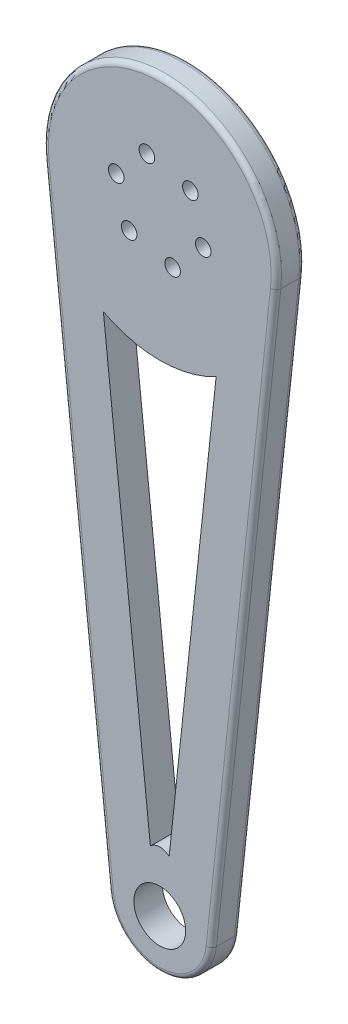
ISO-10303-21;
HEADER;
FILE_DESCRIPTION(('STEP AP214'),'2;1');
FILE_NAME('part.step','',(''),(''),'','','');
FILE_SCHEMA(('AUTOMOTIVE_DESIGN { 1 0 10303 214 1 1 1 1 }'));
ENDSEC;
DATA;
#1=APPLICATION_CONTEXT('core data for automotive mechanical design processes');
#2=APPLICATION_PROTOCOL_DEFINITION('international standard','automotive_design',2000,#1);
#3=PRODUCT_CONTEXT('',#1,'mechanical');
#4=PRODUCT('Part','Part','',(#3));
#5=PRODUCT_RELATED_PRODUCT_CATEGORY('part','',(#4));
#6=PRODUCT_DEFINITION_FORMATION('','',#4);
#7=PRODUCT_DEFINITION_CONTEXT('part definition',#1,'design');
#8=PRODUCT_DEFINITION('design','',#6,#7);
#9=PRODUCT_DEFINITION_SHAPE('','',#8);
#10=(LENGTH_UNIT() NAMED_UNIT(*) SI_UNIT(.MILLI.,.METRE.));
#11=(NAMED_UNIT(*) PLANE_ANGLE_UNIT() SI_UNIT($,.RADIAN.));
#12=(NAMED_UNIT(*) SI_UNIT($,.STERADIAN.) SOLID_ANGLE_UNIT());
#13=UNCERTAINTY_MEASURE_WITH_UNIT(LENGTH_MEASURE(1.E-05),#10,'distance_accuracy_value','');
#14=(GEOMETRIC_REPRESENTATION_CONTEXT(3) GLOBAL_UNCERTAINTY_ASSIGNED_CONTEXT((#13)) GLOBAL_UNIT_ASSIGNED_CONTEXT((#10,
#11,#12)) REPRESENTATION_CONTEXT('',''));
#15=CARTESIAN_POINT('',(0.,0.,0.));
#16=DIRECTION('',(0.,0.,1.));
#17=DIRECTION('',(1.,0.,0.));
#18=AXIS2_PLACEMENT_3D('',#15,#16,#17);
#19=CARTESIAN_POINT('',(-11.8243204000066,-12.5597749612797,-22.));
#20=DIRECTION('',(0.,0.,1.));
#21=DIRECTION('',(1.,0.,0.));
#22=AXIS2_PLACEMENT_3D('',#19,#20,#21);
#23=CYLINDRICAL_SURFACE('',#22,2.);
#24=CARTESIAN_POINT('',(-11.8243204000066,-12.5597749612797,0.));
#25=DIRECTION('',(0.,0.,-1.));
#26=DIRECTION('',(-1.,0.,0.));
#27=AXIS2_PLACEMENT_3D('',#24,#25,#26);
#28=CIRCLE('',#27,2.);
#29=CARTESIAN_POINT('',(-13.8243204000066,-12.5597749612797,0.));
#30=VERTEX_POINT('',#29);
#31=EDGE_CURVE('E239',#30,#30,#28,.T.);
#32=ORIENTED_EDGE('',*,*,#31,.T.);
#33=EDGE_LOOP('',(#32));
#34=FACE_BOUND('',#33,.T.);
#35=CARTESIAN_POINT('',(-11.8243204000066,-12.5597749612797,6.));
#36=DIRECTION('',(0.,0.,1.));
#37=DIRECTION('',(1.,0.,0.));
#38=AXIS2_PLACEMENT_3D('',#35,#36,#37);
#39=CIRCLE('',#38,2.);
#40=CARTESIAN_POINT('',(-9.82432040000657,-12.5597749612797,6.));
#41=VERTEX_POINT('',#40);
#42=EDGE_CURVE('E45',#41,#41,#39,.F.);
#43=ORIENTED_EDGE('',*,*,#42,.F.);
#44=EDGE_LOOP('',(#43));
#45=FACE_BOUND('',#44,.T.);
#46=ADVANCED_FACE('F41',(#34,#45),#23,.F.);
#47=CARTESIAN_POINT('',(4.96492398228066,-16.5200493295321,-22.));
#48=DIRECTION('',(0.,0.,1.));
#49=DIRECTION('',(1.,0.,0.));
#50=AXIS2_PLACEMENT_3D('',#47,#48,#49);
#51=CYLINDRICAL_SURFACE('',#50,2.);
#52=CARTESIAN_POINT('',(4.96492398228066,-16.5200493295321,0.));
#53=DIRECTION('',(0.,0.,-1.));
#54=DIRECTION('',(-1.,0.,0.));
#55=AXIS2_PLACEMENT_3D('',#52,#53,#54);
#56=CIRCLE('',#55,2.);
#57=CARTESIAN_POINT('',(2.96492398228065,-16.5200493295321,0.));
#58=VERTEX_POINT('',#57);
#59=EDGE_CURVE('E242',#58,#58,#56,.T.);
#60=ORIENTED_EDGE('',*,*,#59,.T.);
#61=EDGE_LOOP('',(#60));
#62=FACE_BOUND('',#61,.T.);
#63=CARTESIAN_POINT('',(4.96492398228066,-16.5200493295321,6.));
#64=DIRECTION('',(0.,0.,1.));
#65=DIRECTION('',(1.,0.,0.));
#66=AXIS2_PLACEMENT_3D('',#63,#64,#65);
#67=CIRCLE('',#66,2.);
#68=CARTESIAN_POINT('',(6.96492398228066,-16.5200493295321,6.));
#69=VERTEX_POINT('',#68);
#70=EDGE_CURVE('E269',#69,#69,#67,.F.);
#71=ORIENTED_EDGE('',*,*,#70,.F.);
#72=EDGE_LOOP('',(#71));
#73=FACE_BOUND('',#72,.T.);
#74=ADVANCED_FACE('F279',(#62,#73),#51,.F.);
#75=CARTESIAN_POINT('',(16.7892443822872,-3.96027436825241,-22.));
#76=DIRECTION('',(0.,0.,1.));
#77=DIRECTION('',(1.,0.,0.));
#78=AXIS2_PLACEMENT_3D('',#75,#76,#77);
#79=CYLINDRICAL_SURFACE('',#78,2.);
#80=CARTESIAN_POINT('',(16.7892443822872,-3.96027436825241,0.));
#81=DIRECTION('',(0.,0.,-1.));
#82=DIRECTION('',(-1.,0.,0.));
#83=AXIS2_PLACEMENT_3D('',#80,#81,#82);
#84=CIRCLE('',#83,2.);
#85=CARTESIAN_POINT('',(14.7892443822872,-3.96027436825241,0.));
#86=VERTEX_POINT('',#85);
#87=EDGE_CURVE('E245',#86,#86,#84,.T.);
#88=ORIENTED_EDGE('',*,*,#87,.T.);
#89=EDGE_LOOP('',(#88));
#90=FACE_BOUND('',#89,.T.);
#91=CARTESIAN_POINT('',(16.7892443822872,-3.96027436825241,6.));
#92=DIRECTION('',(0.,0.,1.));
#93=DIRECTION('',(1.,0.,0.));
#94=AXIS2_PLACEMENT_3D('',#91,#92,#93);
#95=CIRCLE('',#94,2.);
#96=CARTESIAN_POINT('',(18.7892443822872,-3.96027436825241,6.));
#97=VERTEX_POINT('',#96);
#98=EDGE_CURVE('E267',#97,#97,#95,.F.);
#99=ORIENTED_EDGE('',*,*,#98,.F.);
#100=EDGE_LOOP('',(#99));
#101=FACE_BOUND('',#100,.T.);
#102=ADVANCED_FACE('F286',(#90,#101),#79,.F.);
#103=CARTESIAN_POINT('',(11.8243204000066,12.5597749612797,-22.));
#104=DIRECTION('',(0.,0.,1.));
#105=DIRECTION('',(1.,0.,0.));
#106=AXIS2_PLACEMENT_3D('',#103,#104,#105);
#107=CYLINDRICAL_SURFACE('',#106,2.);
#108=CARTESIAN_POINT('',(11.8243204000066,12.5597749612797,0.));
#109=DIRECTION('',(0.,0.,-1.));
#110=DIRECTION('',(-1.,0.,0.));
#111=AXIS2_PLACEMENT_3D('',#108,#109,#110);
#112=CIRCLE('',#111,2.);
#113=CARTESIAN_POINT('',(9.82432040000657,12.5597749612797,0.));
#114=VERTEX_POINT('',#113);
#115=EDGE_CURVE('E248',#114,#114,#112,.T.);
#116=ORIENTED_EDGE('',*,*,#115,.T.);
#117=EDGE_LOOP('',(#116));
#118=FACE_BOUND('',#117,.T.);
#119=CARTESIAN_POINT('',(11.8243204000066,12.5597749612797,6.));
#120=DIRECTION('',(0.,0.,1.));
#121=DIRECTION('',(1.,0.,0.));
#122=AXIS2_PLACEMENT_3D('',#119,#120,#121);
#123=CIRCLE('',#122,2.);
#124=CARTESIAN_POINT('',(13.8243204000066,12.5597749612797,6.));
#125=VERTEX_POINT('',#124);
#126=EDGE_CURVE('E264',#125,#125,#123,.F.);
#127=ORIENTED_EDGE('',*,*,#126,.F.);
#128=EDGE_LOOP('',(#127));
#129=FACE_BOUND('',#128,.T.);
#130=ADVANCED_FACE('F594',(#118,#129),#107,.F.);
#131=CARTESIAN_POINT('',(-4.96492398228065,16.5200493295321,-22.));
#132=DIRECTION('',(0.,0.,1.));
#133=DIRECTION('',(1.,0.,0.));
#134=AXIS2_PLACEMENT_3D('',#131,#132,#133);
#135=CYLINDRICAL_SURFACE('',#134,2.);
#136=CARTESIAN_POINT('',(-4.96492398228065,16.5200493295321,0.));
#137=DIRECTION('',(0.,0.,-1.));
#138=DIRECTION('',(-1.,0.,0.));
#139=AXIS2_PLACEMENT_3D('',#136,#137,#138);
#140=CIRCLE('',#139,2.);
#141=CARTESIAN_POINT('',(-6.96492398228065,16.5200493295321,0.));
#142=VERTEX_POINT('',#141);
#143=EDGE_CURVE('E251',#142,#142,#140,.T.);
#144=ORIENTED_EDGE('',*,*,#143,.T.);
#145=EDGE_LOOP('',(#144));
#146=FACE_BOUND('',#145,.T.);
#147=CARTESIAN_POINT('',(-4.96492398228065,16.5200493295321,6.));
#148=DIRECTION('',(0.,0.,1.));
#149=DIRECTION('',(1.,0.,0.));
#150=AXIS2_PLACEMENT_3D('',#147,#148,#149);
#151=CIRCLE('',#150,2.);
#152=CARTESIAN_POINT('',(-2.96492398228065,16.5200493295321,6.));
#153=VERTEX_POINT('',#152);
#154=EDGE_CURVE('E260',#153,#153,#151,.F.);
#155=ORIENTED_EDGE('',*,*,#154,.F.);
#156=EDGE_LOOP('',(#155));
#157=FACE_BOUND('',#156,.T.);
#158=ADVANCED_FACE('F603',(#146,#157),#135,.F.);
#159=CARTESIAN_POINT('',(-16.7892443822872,3.96027436825242,-22.));
#160=DIRECTION('',(0.,0.,1.));
#161=DIRECTION('',(1.,0.,0.));
#162=AXIS2_PLACEMENT_3D('',#159,#160,#161);
#163=CYLINDRICAL_SURFACE('',#162,2.);
#164=CARTESIAN_POINT('',(-16.7892443822872,3.96027436825242,0.));
#165=DIRECTION('',(0.,0.,-1.));
#166=DIRECTION('',(-1.,0.,0.));
#167=AXIS2_PLACEMENT_3D('',#164,#165,#166);
#168=CIRCLE('',#167,2.);
#169=CARTESIAN_POINT('',(-18.7892443822872,3.96027436825242,0.));
#170=VERTEX_POINT('',#169);
#171=EDGE_CURVE('E254',#170,#170,#168,.T.);
#172=ORIENTED_EDGE('',*,*,#171,.T.);
#173=EDGE_LOOP('',(#172));
#174=FACE_BOUND('',#173,.T.);
#175=CARTESIAN_POINT('',(-16.7892443822872,3.96027436825242,6.));
#176=DIRECTION('',(0.,0.,1.));
#177=DIRECTION('',(1.,0.,0.));
#178=AXIS2_PLACEMENT_3D('',#175,#176,#177);
#179=CIRCLE('',#178,2.);
#180=CARTESIAN_POINT('',(-14.7892443822872,3.96027436825242,6.));
#181=VERTEX_POINT('',#180);
#182=EDGE_CURVE('E257',#181,#181,#179,.F.);
#183=ORIENTED_EDGE('',*,*,#182,.F.);
#184=EDGE_LOOP('',(#183));
#185=FACE_BOUND('',#184,.T.);
#186=ADVANCED_FACE('F330',(#174,#185),#163,.F.);
#187=CARTESIAN_POINT('',(0.,0.,11.));
#188=DIRECTION('',(0.,0.,-1.));
#189=DIRECTION('',(-1.,0.,0.));
#190=AXIS2_PLACEMENT_3D('',#187,#188,#189);
#191=CYLINDRICAL_SURFACE('',#190,45.);
#192=DIRECTION('',(0.,0.,-1.));
#193=VECTOR('',#192,1.);
#194=CARTESIAN_POINT('',(-44.744635323375,-4.7872340425532,11.));
#195=LINE('',#194,#193);
#196=CARTESIAN_POINT('',(-44.744635323375,-4.7872340425532,9.));
#197=VERTEX_POINT('',#196);
#198=CARTESIAN_POINT('',(-44.744635323375,-4.7872340425532,2.));
#199=VERTEX_POINT('',#198);
#200=EDGE_CURVE('E186',#197,#199,#195,.T.);
#201=ORIENTED_EDGE('',*,*,#200,.F.);
#202=CARTESIAN_POINT('',(0.,0.,9.));
#203=DIRECTION('',(0.,0.,-1.));
#204=DIRECTION('',(-1.,0.,0.));
#205=AXIS2_PLACEMENT_3D('',#202,#203,#204);
#206=CIRCLE('',#205,45.);
#207=CARTESIAN_POINT('',(44.744635323375,-4.78723404255319,9.));
#208=VERTEX_POINT('',#207);
#209=EDGE_CURVE('E200',#197,#208,#206,.T.);
#210=ORIENTED_EDGE('',*,*,#209,.T.);
#211=DIRECTION('',(0.,0.,-1.));
#212=VECTOR('',#211,1.);
#213=CARTESIAN_POINT('',(44.744635323375,-4.78723404255319,11.));
#214=LINE('',#213,#212);
#215=CARTESIAN_POINT('',(44.744635323375,-4.78723404255319,2.));
#216=VERTEX_POINT('',#215);
#217=EDGE_CURVE('E173',#208,#216,#214,.T.);
#218=ORIENTED_EDGE('',*,*,#217,.T.);
#219=CARTESIAN_POINT('',(0.,0.,2.));
#220=DIRECTION('',(0.,0.,-1.));
#221=DIRECTION('',(-1.,0.,0.));
#222=AXIS2_PLACEMENT_3D('',#219,#220,#221);
#223=CIRCLE('',#222,45.);
#224=EDGE_CURVE('E198',#216,#199,#223,.F.);
#225=ORIENTED_EDGE('',*,*,#224,.T.);
#226=EDGE_LOOP('',(#201,#210,#218,#225));
#227=FACE_BOUND('',#226,.T.);
#228=ADVANCED_FACE('F326',(#227),#191,.T.);
#229=CARTESIAN_POINT('',(-44.744635323375,-4.7872340425532,11.));
#230=DIRECTION('',(0.994325229408334,0.106382978723404,0.));
#231=DIRECTION('',(-0.106382978723404,0.994325229408334,0.));
#232=AXIS2_PLACEMENT_3D('',#229,#230,#231);
#233=PLANE('',#232);
#234=DIRECTION('',(0.,0.,-1.));
#235=VECTOR('',#234,1.);
#236=CARTESIAN_POINT('',(-19.8865045881667,-237.127659574468,11.));
#237=LINE('',#236,#235);
#238=CARTESIAN_POINT('',(-19.8865045881667,-237.127659574468,9.));
#239=VERTEX_POINT('',#238);
#240=CARTESIAN_POINT('',(-19.8865045881667,-237.127659574468,2.));
#241=VERTEX_POINT('',#240);
#242=EDGE_CURVE('E183',#239,#241,#237,.T.);
#243=ORIENTED_EDGE('',*,*,#242,.F.);
#244=DIRECTION('',(0.106382978723404,-0.994325229408334,0.));
#245=VECTOR('',#244,1.);
#246=CARTESIAN_POINT('',(-44.744635323375,-4.7872340425532,9.));
#247=LINE('',#246,#245);
#248=EDGE_CURVE('E214',#239,#197,#247,.F.);
#249=ORIENTED_EDGE('',*,*,#248,.T.);
#250=ORIENTED_EDGE('',*,*,#200,.T.);
#251=DIRECTION('',(0.106382978723404,-0.994325229408334,0.));
#252=VECTOR('',#251,1.);
#253=CARTESIAN_POINT('',(-19.8865045881667,-237.127659574468,2.));
#254=LINE('',#253,#252);
#255=EDGE_CURVE('E212',#199,#241,#254,.T.);
#256=ORIENTED_EDGE('',*,*,#255,.T.);
#257=EDGE_LOOP('',(#243,#249,#250,#256));
#258=FACE_BOUND('',#257,.T.);
#259=ADVANCED_FACE('F322',(#258),#233,.F.);
#260=CARTESIAN_POINT('',(0.,-235.,11.));
#261=DIRECTION('',(0.,0.,-1.));
#262=DIRECTION('',(-1.,0.,0.));
#263=AXIS2_PLACEMENT_3D('',#260,#261,#262);
#264=CYLINDRICAL_SURFACE('',#263,20.);
#265=DIRECTION('',(0.,0.,-1.));
#266=VECTOR('',#265,1.);
#267=CARTESIAN_POINT('',(19.8865045881667,-237.127659574468,11.));
#268=LINE('',#267,#266);
#269=CARTESIAN_POINT('',(19.8865045881667,-237.127659574468,9.));
#270=VERTEX_POINT('',#269);
#271=CARTESIAN_POINT('',(19.8865045881667,-237.127659574468,2.));
#272=VERTEX_POINT('',#271);
#273=EDGE_CURVE('E180',#270,#272,#268,.T.);
#274=ORIENTED_EDGE('',*,*,#273,.F.);
#275=CARTESIAN_POINT('',(0.,-235.,9.));
#276=DIRECTION('',(0.,0.,-1.));
#277=DIRECTION('',(-1.,0.,0.));
#278=AXIS2_PLACEMENT_3D('',#275,#276,#277);
#279=CIRCLE('',#278,20.);
#280=EDGE_CURVE('E206',#270,#239,#279,.T.);
#281=ORIENTED_EDGE('',*,*,#280,.T.);
#282=ORIENTED_EDGE('',*,*,#242,.T.);
#283=CARTESIAN_POINT('',(0.,-235.,2.));
#284=DIRECTION('',(0.,0.,-1.));
#285=DIRECTION('',(-1.,0.,0.));
#286=AXIS2_PLACEMENT_3D('',#283,#284,#285);
#287=CIRCLE('',#286,20.);
#288=EDGE_CURVE('E203',#241,#272,#287,.F.);
#289=ORIENTED_EDGE('',*,*,#288,.T.);
#290=EDGE_LOOP('',(#274,#281,#282,#289));
#291=FACE_BOUND('',#290,.T.);
#292=ADVANCED_FACE('F318',(#291),#264,.T.);
#293=CARTESIAN_POINT('',(44.744635323375,-4.78723404255319,11.));
#294=DIRECTION('',(-0.994325229408334,0.106382978723404,0.));
#295=DIRECTION('',(-0.106382978723404,-0.994325229408334,0.));
#296=AXIS2_PLACEMENT_3D('',#293,#294,#295);
#297=PLANE('',#296);
#298=ORIENTED_EDGE('',*,*,#217,.F.);
#299=DIRECTION('',(0.106382978723404,0.994325229408334,0.));
#300=VECTOR('',#299,1.);
#301=CARTESIAN_POINT('',(44.744635323375,-4.78723404255319,9.));
#302=LINE('',#301,#300);
#303=EDGE_CURVE('E210',#208,#270,#302,.F.);
#304=ORIENTED_EDGE('',*,*,#303,.T.);
#305=ORIENTED_EDGE('',*,*,#273,.T.);
#306=DIRECTION('',(0.106382978723404,0.994325229408334,0.));
#307=VECTOR('',#306,1.);
#308=CARTESIAN_POINT('',(44.744635323375,-4.78723404255319,2.));
#309=LINE('',#308,#307);
#310=EDGE_CURVE('E208',#272,#216,#309,.T.);
#311=ORIENTED_EDGE('',*,*,#310,.T.);
#312=EDGE_LOOP('',(#298,#304,#305,#311));
#313=FACE_BOUND('',#312,.T.);
#314=ADVANCED_FACE('F312',(#313),#297,.F.);
#315=CARTESIAN_POINT('',(0.,0.,11.));
#316=DIRECTION('',(0.,0.,-1.));
#317=DIRECTION('',(-1.,0.,0.));
#318=AXIS2_PLACEMENT_3D('',#315,#316,#317);
#319=PLANE('',#318);
#320=CARTESIAN_POINT('',(11.8243204000066,12.5597749612797,11.));
#321=DIRECTION('',(0.,0.,1.));
#322=DIRECTION('',(1.,0.,0.));
#323=AXIS2_PLACEMENT_3D('',#320,#321,#322);
#324=CIRCLE('',#323,3.);
#325=CARTESIAN_POINT('',(14.8243204000066,12.5597749612797,11.));
#326=VERTEX_POINT('',#325);
#327=EDGE_CURVE('E712',#326,#326,#324,.T.);
#328=ORIENTED_EDGE('',*,*,#327,.F.);
#329=EDGE_LOOP('',(#328));
#330=FACE_BOUND('',#329,.T.);
#331=CARTESIAN_POINT('',(16.7892443822872,-3.96027436825249,11.));
#332=DIRECTION('',(0.,0.,1.));
#333=DIRECTION('',(1.,0.,0.));
#334=AXIS2_PLACEMENT_3D('',#331,#332,#333);
#335=CIRCLE('',#334,3.);
#336=CARTESIAN_POINT('',(19.7892443822872,-3.96027436825249,11.));
#337=VERTEX_POINT('',#336);
#338=EDGE_CURVE('E721',#337,#337,#335,.T.);
#339=ORIENTED_EDGE('',*,*,#338,.F.);
#340=EDGE_LOOP('',(#339));
#341=FACE_BOUND('',#340,.T.);
#342=CARTESIAN_POINT('',(4.96492398228053,-16.5200493295321,11.));
#343=DIRECTION('',(0.,0.,1.));
#344=DIRECTION('',(1.,0.,0.));
#345=AXIS2_PLACEMENT_3D('',#342,#343,#344);
#346=CIRCLE('',#345,3.);
#347=CARTESIAN_POINT('',(7.96492398228053,-16.5200493295321,11.));
#348=VERTEX_POINT('',#347);
#349=EDGE_CURVE('E702',#348,#348,#346,.T.);
#350=ORIENTED_EDGE('',*,*,#349,.F.);
#351=EDGE_LOOP('',(#350));
#352=FACE_BOUND('',#351,.T.);
#353=CARTESIAN_POINT('',(-11.8243204000067,-12.5597749612796,11.));
#354=DIRECTION('',(0.,0.,1.));
#355=DIRECTION('',(1.,0.,0.));
#356=AXIS2_PLACEMENT_3D('',#353,#354,#355);
#357=CIRCLE('',#356,3.);
#358=CARTESIAN_POINT('',(-8.82432040000668,-12.5597749612796,11.));
#359=VERTEX_POINT('',#358);
#360=EDGE_CURVE('E697',#359,#359,#357,.T.);
#361=ORIENTED_EDGE('',*,*,#360,.F.);
#362=EDGE_LOOP('',(#361));
#363=FACE_BOUND('',#362,.T.);
#364=CARTESIAN_POINT('',(-16.7892443822872,3.96027436825261,11.));
#365=DIRECTION('',(0.,0.,1.));
#366=DIRECTION('',(1.,0.,0.));
#367=AXIS2_PLACEMENT_3D('',#364,#365,#366);
#368=CIRCLE('',#367,3.);
#369=CARTESIAN_POINT('',(-13.7892443822872,3.96027436825261,11.));
#370=VERTEX_POINT('',#369);
#371=EDGE_CURVE('E704',#370,#370,#368,.T.);
#372=ORIENTED_EDGE('',*,*,#371,.F.);
#373=EDGE_LOOP('',(#372));
#374=FACE_BOUND('',#373,.T.);
#375=CARTESIAN_POINT('',(-4.96492398228065,16.5200493295321,11.));
#376=DIRECTION('',(0.,0.,1.));
#377=DIRECTION('',(1.,0.,0.));
#378=AXIS2_PLACEMENT_3D('',#375,#376,#377);
#379=CIRCLE('',#378,3.);
#380=CARTESIAN_POINT('',(-1.96492398228065,16.5200493295321,11.));
#381=VERTEX_POINT('',#380);
#382=EDGE_CURVE('E710',#381,#381,#379,.T.);
#383=ORIENTED_EDGE('',*,*,#382,.F.);
#384=EDGE_LOOP('',(#383));
#385=FACE_BOUND('',#384,.T.);
#386=DIRECTION('',(-0.106382978723404,0.994325229408334,0.));
#387=VECTOR('',#386,1.);
#388=CARTESIAN_POINT('',(-26.2400238080358,-2.80742337809627,11.));
#389=LINE('',#388,#387);
#390=CARTESIAN_POINT('',(-3.61533826232206,-214.272602446108,11.));
#391=VERTEX_POINT('',#390);
#392=CARTESIAN_POINT('',(-21.7598242236514,-44.6823128857545,11.));
#393=VERTEX_POINT('',#392);
#394=EDGE_CURVE('E163',#391,#393,#389,.T.);
#395=ORIENTED_EDGE('',*,*,#394,.T.);
#396=CARTESIAN_POINT('',(0.,-3.35092271043229,11.));
#397=DIRECTION('',(0.,0.,-1.));
#398=DIRECTION('',(-1.,0.,0.));
#399=AXIS2_PLACEMENT_3D('',#396,#397,#398);
#400=CIRCLE('',#399,46.7094611836717);
#401=CARTESIAN_POINT('',(21.7598242236514,-44.6823128857545,11.));
#402=VERTEX_POINT('',#401);
#403=EDGE_CURVE('E166',#393,#402,#400,.F.);
#404=ORIENTED_EDGE('',*,*,#403,.T.);
#405=DIRECTION('',(-0.106382978723404,-0.994325229408334,0.));
#406=VECTOR('',#405,1.);
#407=CARTESIAN_POINT('',(26.2400238080358,-2.80742337809627,11.));
#408=LINE('',#407,#406);
#409=CARTESIAN_POINT('',(3.6259912783284,-214.173032357815,11.));
#410=VERTEX_POINT('',#409);
#411=EDGE_CURVE('E158',#402,#410,#408,.T.);
#412=ORIENTED_EDGE('',*,*,#411,.T.);
#413=CARTESIAN_POINT('',(0.0551115521497599,-217.843482172287,11.));
#414=DIRECTION('',(0.,0.,-1.));
#415=DIRECTION('',(-1.,0.,0.));
#416=AXIS2_PLACEMENT_3D('',#413,#414,#415);
#417=CIRCLE('',#416,5.12087725486467);
#418=EDGE_CURVE('E138',#410,#391,#417,.F.);
#419=ORIENTED_EDGE('',*,*,#418,.T.);
#420=EDGE_LOOP('',(#395,#404,#412,#419));
#421=FACE_BOUND('',#420,.T.);
#422=CARTESIAN_POINT('',(0.,-235.,11.));
#423=DIRECTION('',(0.,0.,-1.));
#424=DIRECTION('',(-1.,0.,0.));
#425=AXIS2_PLACEMENT_3D('',#422,#423,#424);
#426=CIRCLE('',#425,18.);
#427=CARTESIAN_POINT('',(-17.89785412935,-236.914893617021,11.));
#428=VERTEX_POINT('',#427);
#429=CARTESIAN_POINT('',(17.89785412935,-236.914893617021,11.));
#430=VERTEX_POINT('',#429);
#431=EDGE_CURVE('E191',#428,#430,#426,.F.);
#432=ORIENTED_EDGE('',*,*,#431,.T.);
#433=DIRECTION('',(0.106382978723404,0.994325229408334,0.));
#434=VECTOR('',#433,1.);
#435=CARTESIAN_POINT('',(42.7559848645584,-4.57446808510638,11.));
#436=LINE('',#435,#434);
#437=CARTESIAN_POINT('',(42.7559848645584,-4.57446808510638,11.));
#438=VERTEX_POINT('',#437);
#439=EDGE_CURVE('E196',#430,#438,#436,.T.);
#440=ORIENTED_EDGE('',*,*,#439,.T.);
#441=CARTESIAN_POINT('',(0.,0.,11.));
#442=DIRECTION('',(0.,0.,-1.));
#443=DIRECTION('',(-1.,0.,0.));
#444=AXIS2_PLACEMENT_3D('',#441,#442,#443);
#445=CIRCLE('',#444,43.);
#446=CARTESIAN_POINT('',(-42.7559848645584,-4.57446808510639,11.));
#447=VERTEX_POINT('',#446);
#448=EDGE_CURVE('E193',#438,#447,#445,.F.);
#449=ORIENTED_EDGE('',*,*,#448,.T.);
#450=DIRECTION('',(0.106382978723404,-0.994325229408334,0.));
#451=VECTOR('',#450,1.);
#452=CARTESIAN_POINT('',(-42.7559848645584,-4.57446808510639,11.));
#453=LINE('',#452,#451);
#454=EDGE_CURVE('E189',#447,#428,#453,.T.);
#455=ORIENTED_EDGE('',*,*,#454,.T.);
#456=EDGE_LOOP('',(#432,#440,#449,#455));
#457=FACE_BOUND('',#456,.T.);
#458=CARTESIAN_POINT('',(0.,-235.836034694728,11.));
#459=DIRECTION('',(0.,0.,-1.));
#460=DIRECTION('',(-1.,0.,0.));
#461=AXIS2_PLACEMENT_3D('',#458,#459,#460);
#462=CIRCLE('',#461,10.);
#463=CARTESIAN_POINT('',(-10.,-235.836034694728,11.));
#464=VERTEX_POINT('',#463);
#465=EDGE_CURVE('E170',#464,#464,#462,.T.);
#466=ORIENTED_EDGE('',*,*,#465,.T.);
#467=EDGE_LOOP('',(#466));
#468=FACE_BOUND('',#467,.T.);
#469=ADVANCED_FACE('F309',(#330,#341,#352,#363,#374,#385,#421,#457,#468),#319,.F.);
#470=CARTESIAN_POINT('',(0.,0.,0.));
#471=DIRECTION('',(0.,0.,-1.));
#472=DIRECTION('',(-1.,0.,0.));
#473=AXIS2_PLACEMENT_3D('',#470,#471,#472);
#474=PLANE('',#473);
#475=ORIENTED_EDGE('',*,*,#171,.F.);
#476=EDGE_LOOP('',(#475));
#477=FACE_BOUND('',#476,.T.);
#478=ORIENTED_EDGE('',*,*,#143,.F.);
#479=EDGE_LOOP('',(#478));
#480=FACE_BOUND('',#479,.T.);
#481=ORIENTED_EDGE('',*,*,#115,.F.);
#482=EDGE_LOOP('',(#481));
#483=FACE_BOUND('',#482,.T.);
#484=ORIENTED_EDGE('',*,*,#87,.F.);
#485=EDGE_LOOP('',(#484));
#486=FACE_BOUND('',#485,.T.);
#487=ORIENTED_EDGE('',*,*,#59,.F.);
#488=EDGE_LOOP('',(#487));
#489=FACE_BOUND('',#488,.T.);
#490=ORIENTED_EDGE('',*,*,#31,.F.);
#491=EDGE_LOOP('',(#490));
#492=FACE_BOUND('',#491,.T.);
#493=CARTESIAN_POINT('',(0.,-3.35092271043229,0.));
#494=DIRECTION('',(0.,0.,1.));
#495=DIRECTION('',(1.,0.,0.));
#496=AXIS2_PLACEMENT_3D('',#493,#494,#495);
#497=CIRCLE('',#496,46.7094611836717);
#498=CARTESIAN_POINT('',(-21.7598242236514,-44.6823128857545,0.));
#499=VERTEX_POINT('',#498);
#500=CARTESIAN_POINT('',(21.7598242236514,-44.6823128857545,0.));
#501=VERTEX_POINT('',#500);
#502=EDGE_CURVE('E66',#499,#501,#497,.T.);
#503=ORIENTED_EDGE('',*,*,#502,.F.);
#504=DIRECTION('',(-0.106382978723404,0.994325229408334,0.));
#505=VECTOR('',#504,1.);
#506=CARTESIAN_POINT('',(-21.7598242236514,-44.6823128857545,0.));
#507=LINE('',#506,#505);
#508=CARTESIAN_POINT('',(-3.61533826232206,-214.272602446108,0.));
#509=VERTEX_POINT('',#508);
#510=EDGE_CURVE('E151',#509,#499,#507,.T.);
#511=ORIENTED_EDGE('',*,*,#510,.F.);
#512=CARTESIAN_POINT('',(0.0551115521497599,-217.843482172287,0.));
#513=DIRECTION('',(0.,0.,1.));
#514=DIRECTION('',(1.,0.,0.));
#515=AXIS2_PLACEMENT_3D('',#512,#513,#514);
#516=CIRCLE('',#515,5.12087725486467);
#517=CARTESIAN_POINT('',(3.6259912783284,-214.173032357815,0.));
#518=VERTEX_POINT('',#517);
#519=EDGE_CURVE('E135',#518,#509,#516,.T.);
#520=ORIENTED_EDGE('',*,*,#519,.F.);
#521=DIRECTION('',(-0.106382978723404,-0.994325229408334,0.));
#522=VECTOR('',#521,1.);
#523=CARTESIAN_POINT('',(21.7598242236514,-44.6823128857545,0.));
#524=LINE('',#523,#522);
#525=EDGE_CURVE('E144',#501,#518,#524,.T.);
#526=ORIENTED_EDGE('',*,*,#525,.F.);
#527=EDGE_LOOP('',(#503,#511,#520,#526));
#528=FACE_BOUND('',#527,.T.);
#529=DIRECTION('',(0.106382978723404,0.994325229408334,0.));
#530=VECTOR('',#529,1.);
#531=CARTESIAN_POINT('',(17.89785412935,-236.914893617021,0.));
#532=LINE('',#531,#530);
#533=CARTESIAN_POINT('',(42.7559848645584,-4.57446808510638,0.));
#534=VERTEX_POINT('',#533);
#535=CARTESIAN_POINT('',(17.89785412935,-236.914893617021,0.));
#536=VERTEX_POINT('',#535);
#537=EDGE_CURVE('E216',#534,#536,#532,.F.);
#538=ORIENTED_EDGE('',*,*,#537,.T.);
#539=CARTESIAN_POINT('',(0.,-235.,0.));
#540=DIRECTION('',(0.,0.,-1.));
#541=DIRECTION('',(-1.,0.,0.));
#542=AXIS2_PLACEMENT_3D('',#539,#540,#541);
#543=CIRCLE('',#542,18.);
#544=CARTESIAN_POINT('',(-17.89785412935,-236.914893617021,0.));
#545=VERTEX_POINT('',#544);
#546=EDGE_CURVE('E11',#536,#545,#543,.T.);
#547=ORIENTED_EDGE('',*,*,#546,.T.);
#548=DIRECTION('',(0.106382978723404,-0.994325229408334,0.));
#549=VECTOR('',#548,1.);
#550=CARTESIAN_POINT('',(-42.7559848645584,-4.57446808510639,0.));
#551=LINE('',#550,#549);
#552=CARTESIAN_POINT('',(-42.7559848645584,-4.57446808510639,0.));
#553=VERTEX_POINT('',#552);
#554=EDGE_CURVE('E50',#545,#553,#551,.F.);
#555=ORIENTED_EDGE('',*,*,#554,.T.);
#556=CARTESIAN_POINT('',(0.,0.,0.));
#557=DIRECTION('',(0.,0.,-1.));
#558=DIRECTION('',(-1.,0.,0.));
#559=AXIS2_PLACEMENT_3D('',#556,#557,#558);
#560=CIRCLE('',#559,43.);
#561=EDGE_CURVE('E218',#553,#534,#560,.T.);
#562=ORIENTED_EDGE('',*,*,#561,.T.);
#563=EDGE_LOOP('',(#538,#547,#555,#562));
#564=FACE_BOUND('',#563,.T.);
#565=CARTESIAN_POINT('',(0.,-235.836034694728,0.));
#566=DIRECTION('',(0.,0.,-1.));
#567=DIRECTION('',(-1.,0.,0.));
#568=AXIS2_PLACEMENT_3D('',#565,#566,#567);
#569=CIRCLE('',#568,10.);
#570=CARTESIAN_POINT('',(-10.,-235.836034694728,0.));
#571=VERTEX_POINT('',#570);
#572=EDGE_CURVE('E174',#571,#571,#569,.T.);
#573=ORIENTED_EDGE('',*,*,#572,.F.);
#574=EDGE_LOOP('',(#573));
#575=FACE_BOUND('',#574,.T.);
#576=ADVANCED_FACE('F148',(#477,#480,#483,#486,#489,#492,#528,#564,#575),#474,.T.);
#577=CARTESIAN_POINT('',(0.,-235.836034694728,11.));
#578=DIRECTION('',(0.,0.,-1.));
#579=DIRECTION('',(-1.,0.,0.));
#580=AXIS2_PLACEMENT_3D('',#577,#578,#579);
#581=CYLINDRICAL_SURFACE('',#580,10.);
#582=ORIENTED_EDGE('',*,*,#465,.F.);
#583=EDGE_LOOP('',(#582));
#584=FACE_BOUND('',#583,.T.);
#585=ORIENTED_EDGE('',*,*,#572,.T.);
#586=EDGE_LOOP('',(#585));
#587=FACE_BOUND('',#586,.T.);
#588=ADVANCED_FACE('F304',(#584,#587),#581,.F.);
#589=CARTESIAN_POINT('',(0.,-235.,9.));
#590=DIRECTION('',(0.,0.,-1.));
#591=DIRECTION('',(-1.,0.,0.));
#592=AXIS2_PLACEMENT_3D('',#589,#590,#591);
#593=TOROIDAL_SURFACE('',#592,18.,2.);
#594=CARTESIAN_POINT('',(-17.89785412935,-236.914893617021,9.));
#595=DIRECTION('',(-0.10638297872341,0.994325229408333,0.));
#596=DIRECTION('',(-0.994325229408333,-0.10638297872341,0.));
#597=AXIS2_PLACEMENT_3D('',#594,#595,#596);
#598=CIRCLE('',#597,2.);
#599=EDGE_CURVE('E226',#239,#428,#598,.T.);
#600=ORIENTED_EDGE('',*,*,#599,.F.);
#601=ORIENTED_EDGE('',*,*,#280,.F.);
#602=CARTESIAN_POINT('',(17.89785412935,-236.914893617021,9.));
#603=DIRECTION('',(0.10638297872341,0.994325229408333,0.));
#604=DIRECTION('',(-0.994325229408333,0.10638297872341,0.));
#605=AXIS2_PLACEMENT_3D('',#602,#603,#604);
#606=CIRCLE('',#605,2.);
#607=EDGE_CURVE('E177',#430,#270,#606,.T.);
#608=ORIENTED_EDGE('',*,*,#607,.F.);
#609=ORIENTED_EDGE('',*,*,#431,.F.);
#610=EDGE_LOOP('',(#600,#601,#608,#609));
#611=FACE_BOUND('',#610,.T.);
#612=ADVANCED_FACE('F307',(#611),#593,.T.);
#613=CARTESIAN_POINT('',(42.7559848645584,-4.57446808510638,9.));
#614=DIRECTION('',(0.106382978723404,0.994325229408334,0.));
#615=DIRECTION('',(-0.994325229408334,0.106382978723404,0.));
#616=AXIS2_PLACEMENT_3D('',#613,#614,#615);
#617=CYLINDRICAL_SURFACE('',#616,2.);
#618=ORIENTED_EDGE('',*,*,#607,.T.);
#619=ORIENTED_EDGE('',*,*,#303,.F.);
#620=CARTESIAN_POINT('',(42.7559848645584,-4.57446808510638,9.));
#621=DIRECTION('',(0.106382978723404,0.994325229408334,0.));
#622=DIRECTION('',(-0.994325229408334,0.106382978723404,0.));
#623=AXIS2_PLACEMENT_3D('',#620,#621,#622);
#624=CIRCLE('',#623,2.);
#625=EDGE_CURVE('E223',#438,#208,#624,.T.);
#626=ORIENTED_EDGE('',*,*,#625,.F.);
#627=ORIENTED_EDGE('',*,*,#439,.F.);
#628=EDGE_LOOP('',(#618,#619,#626,#627));
#629=FACE_BOUND('',#628,.T.);
#630=ADVANCED_FACE('F339',(#629),#617,.T.);
#631=CARTESIAN_POINT('',(-42.7559848645584,-4.57446808510639,9.));
#632=DIRECTION('',(0.106382978723404,-0.994325229408334,0.));
#633=DIRECTION('',(0.994325229408334,0.106382978723404,0.));
#634=AXIS2_PLACEMENT_3D('',#631,#632,#633);
#635=CYLINDRICAL_SURFACE('',#634,2.);
#636=ORIENTED_EDGE('',*,*,#599,.T.);
#637=ORIENTED_EDGE('',*,*,#454,.F.);
#638=CARTESIAN_POINT('',(-42.7559848645584,-4.57446808510639,9.));
#639=DIRECTION('',(-0.106382978723404,0.994325229408334,0.));
#640=DIRECTION('',(-0.994325229408334,-0.106382978723404,0.));
#641=AXIS2_PLACEMENT_3D('',#638,#639,#640);
#642=CIRCLE('',#641,2.);
#643=EDGE_CURVE('E221',#197,#447,#642,.T.);
#644=ORIENTED_EDGE('',*,*,#643,.F.);
#645=ORIENTED_EDGE('',*,*,#248,.F.);
#646=EDGE_LOOP('',(#636,#637,#644,#645));
#647=FACE_BOUND('',#646,.T.);
#648=ADVANCED_FACE('F335',(#647),#635,.T.);
#649=CARTESIAN_POINT('',(0.,0.,9.));
#650=DIRECTION('',(0.,0.,-1.));
#651=DIRECTION('',(-1.,0.,0.));
#652=AXIS2_PLACEMENT_3D('',#649,#650,#651);
#653=TOROIDAL_SURFACE('',#652,43.,2.);
#654=ORIENTED_EDGE('',*,*,#625,.T.);
#655=ORIENTED_EDGE('',*,*,#209,.F.);
#656=ORIENTED_EDGE('',*,*,#643,.T.);
#657=ORIENTED_EDGE('',*,*,#448,.F.);
#658=EDGE_LOOP('',(#654,#655,#656,#657));
#659=FACE_BOUND('',#658,.T.);
#660=ADVANCED_FACE('F332',(#659),#653,.T.);
#661=CARTESIAN_POINT('',(0.,0.,2.));
#662=DIRECTION('',(0.,0.,-1.));
#663=DIRECTION('',(-1.,0.,0.));
#664=AXIS2_PLACEMENT_3D('',#661,#662,#663);
#665=TOROIDAL_SURFACE('',#664,43.,2.);
#666=CARTESIAN_POINT('',(42.7559848645584,-4.57446808510638,2.));
#667=DIRECTION('',(-0.106382978723404,-0.994325229408334,0.));
#668=DIRECTION('',(0.994325229408334,-0.106382978723404,0.));
#669=AXIS2_PLACEMENT_3D('',#666,#667,#668);
#670=CIRCLE('',#669,2.);
#671=EDGE_CURVE('E234',#534,#216,#670,.T.);
#672=ORIENTED_EDGE('',*,*,#671,.F.);
#673=ORIENTED_EDGE('',*,*,#561,.F.);
#674=CARTESIAN_POINT('',(-42.7559848645584,-4.57446808510639,2.));
#675=DIRECTION('',(0.106382978723404,-0.994325229408334,0.));
#676=DIRECTION('',(0.994325229408334,0.106382978723404,0.));
#677=AXIS2_PLACEMENT_3D('',#674,#675,#676);
#678=CIRCLE('',#677,2.);
#679=EDGE_CURVE('E224',#199,#553,#678,.T.);
#680=ORIENTED_EDGE('',*,*,#679,.F.);
#681=ORIENTED_EDGE('',*,*,#224,.F.);
#682=EDGE_LOOP('',(#672,#673,#680,#681));
#683=FACE_BOUND('',#682,.T.);
#684=ADVANCED_FACE('F43',(#683),#665,.T.);
#685=CARTESIAN_POINT('',(-42.7559848645584,-4.57446808510639,2.));
#686=DIRECTION('',(-0.106382978723404,0.994325229408334,0.));
#687=DIRECTION('',(-0.994325229408334,-0.106382978723404,0.));
#688=AXIS2_PLACEMENT_3D('',#685,#686,#687);
#689=CYLINDRICAL_SURFACE('',#688,2.);
#690=ORIENTED_EDGE('',*,*,#679,.T.);
#691=ORIENTED_EDGE('',*,*,#554,.F.);
#692=CARTESIAN_POINT('',(-17.89785412935,-236.914893617021,2.));
#693=DIRECTION('',(0.10638297872341,-0.994325229408333,0.));
#694=DIRECTION('',(0.994325229408333,0.10638297872341,0.));
#695=AXIS2_PLACEMENT_3D('',#692,#693,#694);
#696=CIRCLE('',#695,2.);
#697=EDGE_CURVE('E232',#241,#545,#696,.T.);
#698=ORIENTED_EDGE('',*,*,#697,.F.);
#699=ORIENTED_EDGE('',*,*,#255,.F.);
#700=EDGE_LOOP('',(#690,#691,#698,#699));
#701=FACE_BOUND('',#700,.T.);
#702=ADVANCED_FACE('F352',(#701),#689,.T.);
#703=CARTESIAN_POINT('',(42.7559848645584,-4.57446808510638,2.));
#704=DIRECTION('',(-0.106382978723404,-0.994325229408334,0.));
#705=DIRECTION('',(0.994325229408334,-0.106382978723404,0.));
#706=AXIS2_PLACEMENT_3D('',#703,#704,#705);
#707=CYLINDRICAL_SURFACE('',#706,2.);
#708=ORIENTED_EDGE('',*,*,#671,.T.);
#709=ORIENTED_EDGE('',*,*,#310,.F.);
#710=CARTESIAN_POINT('',(17.89785412935,-236.914893617021,2.));
#711=DIRECTION('',(-0.10638297872341,-0.994325229408333,0.));
#712=DIRECTION('',(0.994325229408333,-0.10638297872341,0.));
#713=AXIS2_PLACEMENT_3D('',#710,#711,#712);
#714=CIRCLE('',#713,2.);
#715=EDGE_CURVE('E169',#536,#272,#714,.T.);
#716=ORIENTED_EDGE('',*,*,#715,.F.);
#717=ORIENTED_EDGE('',*,*,#537,.F.);
#718=EDGE_LOOP('',(#708,#709,#716,#717));
#719=FACE_BOUND('',#718,.T.);
#720=ADVANCED_FACE('F349',(#719),#707,.T.);
#721=CARTESIAN_POINT('',(0.,-235.,2.));
#722=DIRECTION('',(0.,0.,-1.));
#723=DIRECTION('',(-1.,0.,0.));
#724=AXIS2_PLACEMENT_3D('',#721,#722,#723);
#725=TOROIDAL_SURFACE('',#724,18.,2.);
#726=ORIENTED_EDGE('',*,*,#697,.T.);
#727=ORIENTED_EDGE('',*,*,#546,.F.);
#728=ORIENTED_EDGE('',*,*,#715,.T.);
#729=ORIENTED_EDGE('',*,*,#288,.F.);
#730=EDGE_LOOP('',(#726,#727,#728,#729));
#731=FACE_BOUND('',#730,.T.);
#732=ADVANCED_FACE('F303',(#731),#725,.T.);
#733=CARTESIAN_POINT('',(0.,-3.35092271043229,20.));
#734=DIRECTION('',(0.,0.,-1.));
#735=DIRECTION('',(-1.,0.,0.));
#736=AXIS2_PLACEMENT_3D('',#733,#734,#735);
#737=CYLINDRICAL_SURFACE('',#736,46.7094611836717);
#738=DIRECTION('',(0.,0.,-1.));
#739=VECTOR('',#738,1.);
#740=CARTESIAN_POINT('',(-21.7598242236514,-44.6823128857545,20.));
#741=LINE('',#740,#739);
#742=EDGE_CURVE('E156',#393,#499,#741,.T.);
#743=ORIENTED_EDGE('',*,*,#742,.T.);
#744=ORIENTED_EDGE('',*,*,#502,.T.);
#745=DIRECTION('',(0.,0.,-1.));
#746=VECTOR('',#745,1.);
#747=CARTESIAN_POINT('',(21.7598242236514,-44.6823128857545,20.));
#748=LINE('',#747,#746);
#749=EDGE_CURVE('E141',#402,#501,#748,.T.);
#750=ORIENTED_EDGE('',*,*,#749,.F.);
#751=ORIENTED_EDGE('',*,*,#403,.F.);
#752=EDGE_LOOP('',(#743,#744,#750,#751));
#753=FACE_BOUND('',#752,.T.);
#754=ADVANCED_FACE('F294',(#753),#737,.T.);
#755=CARTESIAN_POINT('',(-21.7598242236514,-44.6823128857545,20.));
#756=DIRECTION('',(-0.994325229408334,-0.106382978723404,0.));
#757=DIRECTION('',(0.106382978723404,-0.994325229408334,0.));
#758=AXIS2_PLACEMENT_3D('',#755,#756,#757);
#759=PLANE('',#758);
#760=DIRECTION('',(0.,0.,-1.));
#761=VECTOR('',#760,1.);
#762=CARTESIAN_POINT('',(-3.61533826232206,-214.272602446108,20.));
#763=LINE('',#762,#761);
#764=EDGE_CURVE('E140',#391,#509,#763,.T.);
#765=ORIENTED_EDGE('',*,*,#764,.T.);
#766=ORIENTED_EDGE('',*,*,#510,.T.);
#767=ORIENTED_EDGE('',*,*,#742,.F.);
#768=ORIENTED_EDGE('',*,*,#394,.F.);
#769=EDGE_LOOP('',(#765,#766,#767,#768));
#770=FACE_BOUND('',#769,.T.);
#771=ADVANCED_FACE('F291',(#770),#759,.F.);
#772=CARTESIAN_POINT('',(0.0551115521497599,-217.843482172287,20.));
#773=DIRECTION('',(0.,0.,-1.));
#774=DIRECTION('',(-1.,0.,0.));
#775=AXIS2_PLACEMENT_3D('',#772,#773,#774);
#776=CYLINDRICAL_SURFACE('',#775,5.12087725486467);
#777=DIRECTION('',(0.,0.,-1.));
#778=VECTOR('',#777,1.);
#779=CARTESIAN_POINT('',(3.6259912783284,-214.173032357815,20.));
#780=LINE('',#779,#778);
#781=EDGE_CURVE('E58',#410,#518,#780,.T.);
#782=ORIENTED_EDGE('',*,*,#781,.T.);
#783=ORIENTED_EDGE('',*,*,#519,.T.);
#784=ORIENTED_EDGE('',*,*,#764,.F.);
#785=ORIENTED_EDGE('',*,*,#418,.F.);
#786=EDGE_LOOP('',(#782,#783,#784,#785));
#787=FACE_BOUND('',#786,.T.);
#788=ADVANCED_FACE('F132',(#787),#776,.T.);
#789=CARTESIAN_POINT('',(21.7598242236514,-44.6823128857545,20.));
#790=DIRECTION('',(0.994325229408334,-0.106382978723404,0.));
#791=DIRECTION('',(0.106382978723404,0.994325229408334,0.));
#792=AXIS2_PLACEMENT_3D('',#789,#790,#791);
#793=PLANE('',#792);
#794=ORIENTED_EDGE('',*,*,#749,.T.);
#795=ORIENTED_EDGE('',*,*,#525,.T.);
#796=ORIENTED_EDGE('',*,*,#781,.F.);
#797=ORIENTED_EDGE('',*,*,#411,.F.);
#798=EDGE_LOOP('',(#794,#795,#796,#797));
#799=FACE_BOUND('',#798,.T.);
#800=ADVANCED_FACE('F145',(#799),#793,.F.);
#801=CARTESIAN_POINT('',(-16.7892443822872,3.96027436825261,6.));
#802=DIRECTION('',(0.,0.,1.));
#803=DIRECTION('',(1.,0.,0.));
#804=AXIS2_PLACEMENT_3D('',#801,#802,#803);
#805=PLANE('',#804);
#806=CARTESIAN_POINT('',(-16.7892443822872,3.96027436825261,6.));
#807=DIRECTION('',(0.,0.,1.));
#808=DIRECTION('',(1.,0.,0.));
#809=AXIS2_PLACEMENT_3D('',#806,#807,#808);
#810=CIRCLE('',#809,3.);
#811=CARTESIAN_POINT('',(-13.7892443822872,3.96027436825261,6.));
#812=VERTEX_POINT('',#811);
#813=EDGE_CURVE('E724',#812,#812,#810,.T.);
#814=ORIENTED_EDGE('',*,*,#813,.T.);
#815=EDGE_LOOP('',(#814));
#816=FACE_BOUND('',#815,.T.);
#817=ORIENTED_EDGE('',*,*,#182,.T.);
#818=EDGE_LOOP('',(#817));
#819=FACE_BOUND('',#818,.T.);
#820=ADVANCED_FACE('F300',(#816,#819),#805,.T.);
#821=CARTESIAN_POINT('',(-16.7892443822872,3.96027436825261,6.));
#822=DIRECTION('',(0.,0.,1.));
#823=DIRECTION('',(1.,0.,0.));
#824=AXIS2_PLACEMENT_3D('',#821,#822,#823);
#825=CYLINDRICAL_SURFACE('',#824,3.);
#826=ORIENTED_EDGE('',*,*,#813,.F.);
#827=EDGE_LOOP('',(#826));
#828=FACE_BOUND('',#827,.T.);
#829=ORIENTED_EDGE('',*,*,#371,.T.);
#830=EDGE_LOOP('',(#829));
#831=FACE_BOUND('',#830,.T.);
#832=ADVANCED_FACE('F465',(#828,#831),#825,.F.);
#833=CARTESIAN_POINT('',(-4.96492398228065,16.5200493295321,6.));
#834=DIRECTION('',(0.,0.,1.));
#835=DIRECTION('',(1.,0.,0.));
#836=AXIS2_PLACEMENT_3D('',#833,#834,#835);
#837=PLANE('',#836);
#838=CARTESIAN_POINT('',(-4.96492398228065,16.5200493295321,6.));
#839=DIRECTION('',(0.,0.,1.));
#840=DIRECTION('',(1.,0.,0.));
#841=AXIS2_PLACEMENT_3D('',#838,#839,#840);
#842=CIRCLE('',#841,3.);
#843=CARTESIAN_POINT('',(-1.96492398228065,16.5200493295321,6.));
#844=VERTEX_POINT('',#843);
#845=EDGE_CURVE('E261',#844,#844,#842,.T.);
#846=ORIENTED_EDGE('',*,*,#845,.T.);
#847=EDGE_LOOP('',(#846));
#848=FACE_BOUND('',#847,.T.);
#849=ORIENTED_EDGE('',*,*,#154,.T.);
#850=EDGE_LOOP('',(#849));
#851=FACE_BOUND('',#850,.T.);
#852=ADVANCED_FACE('F475',(#848,#851),#837,.T.);
#853=CARTESIAN_POINT('',(-4.96492398228065,16.5200493295321,6.));
#854=DIRECTION('',(0.,0.,1.));
#855=DIRECTION('',(1.,0.,0.));
#856=AXIS2_PLACEMENT_3D('',#853,#854,#855);
#857=CYLINDRICAL_SURFACE('',#856,3.);
#858=ORIENTED_EDGE('',*,*,#845,.F.);
#859=EDGE_LOOP('',(#858));
#860=FACE_BOUND('',#859,.T.);
#861=ORIENTED_EDGE('',*,*,#382,.T.);
#862=EDGE_LOOP('',(#861));
#863=FACE_BOUND('',#862,.T.);
#864=ADVANCED_FACE('F484',(#860,#863),#857,.F.);
#865=CARTESIAN_POINT('',(11.8243204000066,12.5597749612797,6.));
#866=DIRECTION('',(0.,0.,1.));
#867=DIRECTION('',(1.,0.,0.));
#868=AXIS2_PLACEMENT_3D('',#865,#866,#867);
#869=PLANE('',#868);
#870=CARTESIAN_POINT('',(11.8243204000066,12.5597749612797,6.));
#871=DIRECTION('',(0.,0.,1.));
#872=DIRECTION('',(1.,0.,0.));
#873=AXIS2_PLACEMENT_3D('',#870,#871,#872);
#874=CIRCLE('',#873,3.);
#875=CARTESIAN_POINT('',(14.8243204000066,12.5597749612797,6.));
#876=VERTEX_POINT('',#875);
#877=EDGE_CURVE('E716',#876,#876,#874,.T.);
#878=ORIENTED_EDGE('',*,*,#877,.T.);
#879=EDGE_LOOP('',(#878));
#880=FACE_BOUND('',#879,.T.);
#881=ORIENTED_EDGE('',*,*,#126,.T.);
#882=EDGE_LOOP('',(#881));
#883=FACE_BOUND('',#882,.T.);
#884=ADVANCED_FACE('F493',(#880,#883),#869,.T.);
#885=CARTESIAN_POINT('',(11.8243204000066,12.5597749612797,6.));
#886=DIRECTION('',(0.,0.,1.));
#887=DIRECTION('',(1.,0.,0.));
#888=AXIS2_PLACEMENT_3D('',#885,#886,#887);
#889=CYLINDRICAL_SURFACE('',#888,3.);
#890=ORIENTED_EDGE('',*,*,#877,.F.);
#891=EDGE_LOOP('',(#890));
#892=FACE_BOUND('',#891,.T.);
#893=ORIENTED_EDGE('',*,*,#327,.T.);
#894=EDGE_LOOP('',(#893));
#895=FACE_BOUND('',#894,.T.);
#896=ADVANCED_FACE('F502',(#892,#895),#889,.F.);
#897=CARTESIAN_POINT('',(16.7892443822872,-3.96027436825249,6.));
#898=DIRECTION('',(0.,0.,1.));
#899=DIRECTION('',(1.,0.,0.));
#900=AXIS2_PLACEMENT_3D('',#897,#898,#899);
#901=PLANE('',#900);
#902=CARTESIAN_POINT('',(16.7892443822872,-3.96027436825249,6.));
#903=DIRECTION('',(0.,0.,1.));
#904=DIRECTION('',(1.,0.,0.));
#905=AXIS2_PLACEMENT_3D('',#902,#903,#904);
#906=CIRCLE('',#905,3.);
#907=CARTESIAN_POINT('',(19.7892443822872,-3.96027436825249,6.));
#908=VERTEX_POINT('',#907);
#909=EDGE_CURVE('E729',#908,#908,#906,.T.);
#910=ORIENTED_EDGE('',*,*,#909,.T.);
#911=EDGE_LOOP('',(#910));
#912=FACE_BOUND('',#911,.T.);
#913=ORIENTED_EDGE('',*,*,#98,.T.);
#914=EDGE_LOOP('',(#913));
#915=FACE_BOUND('',#914,.T.);
#916=ADVANCED_FACE('F511',(#912,#915),#901,.T.);
#917=CARTESIAN_POINT('',(16.7892443822872,-3.96027436825249,6.));
#918=DIRECTION('',(0.,0.,1.));
#919=DIRECTION('',(1.,0.,0.));
#920=AXIS2_PLACEMENT_3D('',#917,#918,#919);
#921=CYLINDRICAL_SURFACE('',#920,3.);
#922=ORIENTED_EDGE('',*,*,#909,.F.);
#923=EDGE_LOOP('',(#922));
#924=FACE_BOUND('',#923,.T.);
#925=ORIENTED_EDGE('',*,*,#338,.T.);
#926=EDGE_LOOP('',(#925));
#927=FACE_BOUND('',#926,.T.);
#928=ADVANCED_FACE('F520',(#924,#927),#921,.F.);
#929=CARTESIAN_POINT('',(4.96492398228053,-16.5200493295321,6.));
#930=DIRECTION('',(0.,0.,1.));
#931=DIRECTION('',(1.,0.,0.));
#932=AXIS2_PLACEMENT_3D('',#929,#930,#931);
#933=PLANE('',#932);
#934=CARTESIAN_POINT('',(4.96492398228053,-16.5200493295321,6.));
#935=DIRECTION('',(0.,0.,1.));
#936=DIRECTION('',(1.,0.,0.));
#937=AXIS2_PLACEMENT_3D('',#934,#935,#936);
#938=CIRCLE('',#937,3.);
#939=CARTESIAN_POINT('',(7.96492398228053,-16.5200493295321,6.));
#940=VERTEX_POINT('',#939);
#941=EDGE_CURVE('E699',#940,#940,#938,.T.);
#942=ORIENTED_EDGE('',*,*,#941,.T.);
#943=EDGE_LOOP('',(#942));
#944=FACE_BOUND('',#943,.T.);
#945=ORIENTED_EDGE('',*,*,#70,.T.);
#946=EDGE_LOOP('',(#945));
#947=FACE_BOUND('',#946,.T.);
#948=ADVANCED_FACE('F529',(#944,#947),#933,.T.);
#949=CARTESIAN_POINT('',(4.96492398228053,-16.5200493295321,6.));
#950=DIRECTION('',(0.,0.,1.));
#951=DIRECTION('',(1.,0.,0.));
#952=AXIS2_PLACEMENT_3D('',#949,#950,#951);
#953=CYLINDRICAL_SURFACE('',#952,3.);
#954=ORIENTED_EDGE('',*,*,#941,.F.);
#955=EDGE_LOOP('',(#954));
#956=FACE_BOUND('',#955,.T.);
#957=ORIENTED_EDGE('',*,*,#349,.T.);
#958=EDGE_LOOP('',(#957));
#959=FACE_BOUND('',#958,.T.);
#960=ADVANCED_FACE('F538',(#956,#959),#953,.F.);
#961=CARTESIAN_POINT('',(-11.8243204000067,-12.5597749612796,6.));
#962=DIRECTION('',(0.,0.,1.));
#963=DIRECTION('',(1.,0.,0.));
#964=AXIS2_PLACEMENT_3D('',#961,#962,#963);
#965=PLANE('',#964);
#966=CARTESIAN_POINT('',(-11.8243204000067,-12.5597749612796,6.));
#967=DIRECTION('',(0.,0.,1.));
#968=DIRECTION('',(1.,0.,0.));
#969=AXIS2_PLACEMENT_3D('',#966,#967,#968);
#970=CIRCLE('',#969,3.);
#971=CARTESIAN_POINT('',(-8.82432040000668,-12.5597749612796,6.));
#972=VERTEX_POINT('',#971);
#973=EDGE_CURVE('E694',#972,#972,#970,.T.);
#974=ORIENTED_EDGE('',*,*,#973,.T.);
#975=EDGE_LOOP('',(#974));
#976=FACE_BOUND('',#975,.T.);
#977=ORIENTED_EDGE('',*,*,#42,.T.);
#978=EDGE_LOOP('',(#977));
#979=FACE_BOUND('',#978,.T.);
#980=ADVANCED_FACE('F276',(#976,#979),#965,.T.);
#981=CARTESIAN_POINT('',(-11.8243204000067,-12.5597749612796,6.));
#982=DIRECTION('',(0.,0.,1.));
#983=DIRECTION('',(1.,0.,0.));
#984=AXIS2_PLACEMENT_3D('',#981,#982,#983);
#985=CYLINDRICAL_SURFACE('',#984,3.);
#986=ORIENTED_EDGE('',*,*,#973,.F.);
#987=EDGE_LOOP('',(#986));
#988=FACE_BOUND('',#987,.T.);
#989=ORIENTED_EDGE('',*,*,#360,.T.);
#990=EDGE_LOOP('',(#989));
#991=FACE_BOUND('',#990,.T.);
#992=ADVANCED_FACE('F555',(#988,#991),#985,.F.);
#993=CLOSED_SHELL('',(#46,#74,#102,#130,#158,#186,#228,#259,#292,#314,#469,#576,#588,#612,#630,
#648,#660,#684,#702,#720,#732,#754,#771,#788,#800,#820,#832,#852,#864,#884,#896,#916,#928,#948,
#960,#980,#992));
#994=MANIFOLD_SOLID_BREP('B2',#993);
#995=ADVANCED_BREP_SHAPE_REPRESENTATION('',(#18,#994),#14);
#996=SHAPE_DEFINITION_REPRESENTATION(#9,#995);
ENDSEC;
END-ISO-10303-21;
